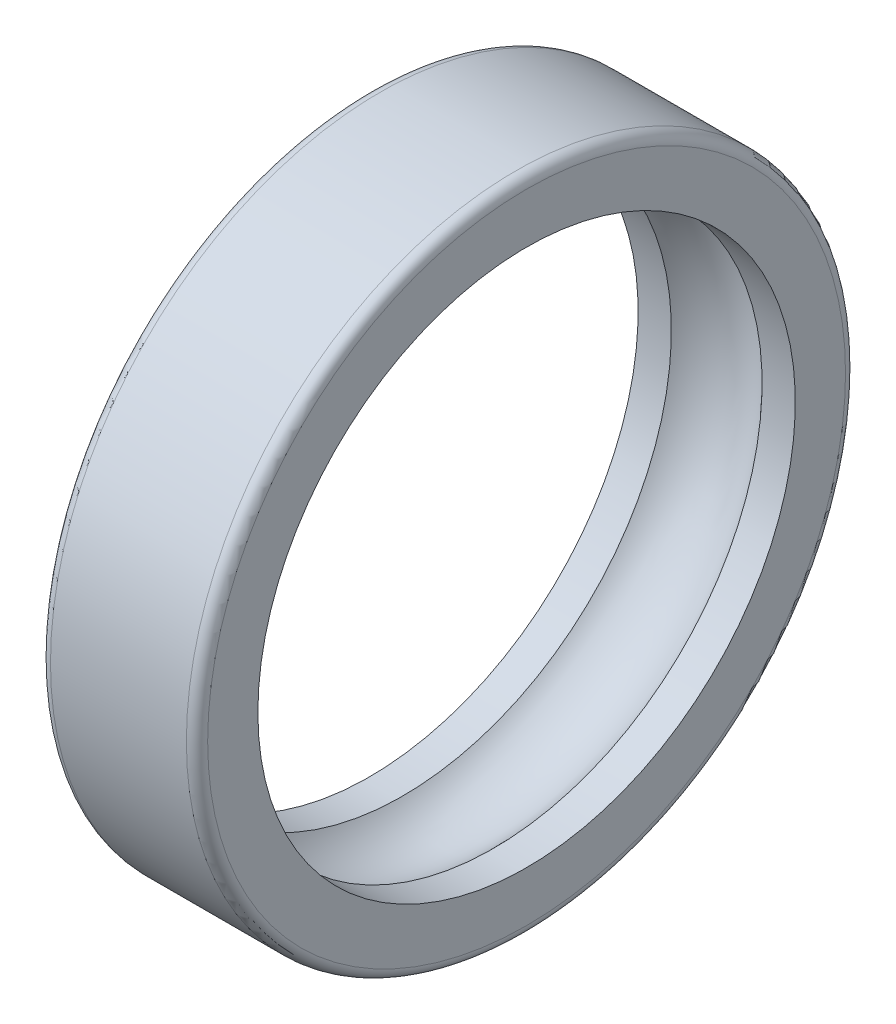
ISO-10303-21;
HEADER;
FILE_DESCRIPTION(('STEP AP214'),'2;1');
FILE_NAME('part.step','',(''),(''),'','','');
FILE_SCHEMA(('AUTOMOTIVE_DESIGN { 1 0 10303 214 1 1 1 1 }'));
ENDSEC;
DATA;
#1=APPLICATION_CONTEXT('core data for automotive mechanical design processes');
#2=APPLICATION_PROTOCOL_DEFINITION('international standard','automotive_design',2000,#1);
#3=PRODUCT_CONTEXT('',#1,'mechanical');
#4=PRODUCT('Part','Part','',(#3));
#5=PRODUCT_RELATED_PRODUCT_CATEGORY('part','',(#4));
#6=PRODUCT_DEFINITION_FORMATION('','',#4);
#7=PRODUCT_DEFINITION_CONTEXT('part definition',#1,'design');
#8=PRODUCT_DEFINITION('design','',#6,#7);
#9=PRODUCT_DEFINITION_SHAPE('','',#8);
#10=(LENGTH_UNIT() NAMED_UNIT(*) SI_UNIT(.MILLI.,.METRE.));
#11=(NAMED_UNIT(*) PLANE_ANGLE_UNIT() SI_UNIT($,.RADIAN.));
#12=(NAMED_UNIT(*) SI_UNIT($,.STERADIAN.) SOLID_ANGLE_UNIT());
#13=UNCERTAINTY_MEASURE_WITH_UNIT(LENGTH_MEASURE(1.E-05),#10,'distance_accuracy_value','');
#14=(GEOMETRIC_REPRESENTATION_CONTEXT(3) GLOBAL_UNCERTAINTY_ASSIGNED_CONTEXT((#13)) GLOBAL_UNIT_ASSIGNED_CONTEXT((#10,
#11,#12)) REPRESENTATION_CONTEXT('',''));
#15=CARTESIAN_POINT('',(0.,0.,0.));
#16=DIRECTION('',(0.,0.,1.));
#17=DIRECTION('',(1.,0.,0.));
#18=AXIS2_PLACEMENT_3D('',#15,#16,#17);
#19=CARTESIAN_POINT('',(-15.5,53.,0.));
#20=DIRECTION('',(1.,0.,0.));
#21=DIRECTION('',(0.,0.,-1.));
#22=AXIS2_PLACEMENT_3D('',#19,#20,#21);
#23=PLANE('',#22);
#24=CARTESIAN_POINT('',(-15.5,0.,0.));
#25=DIRECTION('',(1.,0.,0.));
#26=DIRECTION('',(0.,0.,-1.));
#27=AXIS2_PLACEMENT_3D('',#24,#25,#26);
#28=CIRCLE('',#27,62.9);
#29=CARTESIAN_POINT('',(-15.5,0.,-62.9));
#30=VERTEX_POINT('',#29);
#31=EDGE_CURVE('E10',#30,#30,#28,.F.);
#32=ORIENTED_EDGE('',*,*,#31,.T.);
#33=EDGE_LOOP('',(#32));
#34=FACE_BOUND('',#33,.T.);
#35=CARTESIAN_POINT('',(-15.5,0.,0.));
#36=DIRECTION('',(-1.,0.,0.));
#37=DIRECTION('',(0.,0.,1.));
#38=AXIS2_PLACEMENT_3D('',#35,#36,#37);
#39=CIRCLE('',#38,53.);
#40=CARTESIAN_POINT('',(-15.5,0.,53.));
#41=VERTEX_POINT('',#40);
#42=EDGE_CURVE('E68',#41,#41,#39,.T.);
#43=ORIENTED_EDGE('',*,*,#42,.F.);
#44=EDGE_LOOP('',(#43));
#45=FACE_BOUND('',#44,.T.);
#46=ADVANCED_FACE('F39',(#34,#45),#23,.F.);
#47=CARTESIAN_POINT('',(-18.2883597883598,0.,0.));
#48=DIRECTION('',(-1.,0.,0.));
#49=DIRECTION('',(0.,0.,1.));
#50=AXIS2_PLACEMENT_3D('',#47,#48,#49);
#51=CYLINDRICAL_SURFACE('',#50,65.);
#52=CARTESIAN_POINT('',(13.4,0.,0.));
#53=DIRECTION('',(-1.,0.,0.));
#54=DIRECTION('',(0.,0.,1.));
#55=AXIS2_PLACEMENT_3D('',#52,#53,#54);
#56=CIRCLE('',#55,65.);
#57=CARTESIAN_POINT('',(13.4,0.,65.));
#58=VERTEX_POINT('',#57);
#59=EDGE_CURVE('E50',#58,#58,#56,.T.);
#60=ORIENTED_EDGE('',*,*,#59,.T.);
#61=EDGE_LOOP('',(#60));
#62=FACE_BOUND('',#61,.T.);
#63=CARTESIAN_POINT('',(-13.4,0.,0.));
#64=DIRECTION('',(1.,0.,0.));
#65=DIRECTION('',(0.,0.,-1.));
#66=AXIS2_PLACEMENT_3D('',#63,#64,#65);
#67=CIRCLE('',#66,65.);
#68=CARTESIAN_POINT('',(-13.4,0.,-65.));
#69=VERTEX_POINT('',#68);
#70=EDGE_CURVE('E54',#69,#69,#67,.T.);
#71=ORIENTED_EDGE('',*,*,#70,.T.);
#72=EDGE_LOOP('',(#71));
#73=FACE_BOUND('',#72,.T.);
#74=ADVANCED_FACE('F75',(#62,#73),#51,.T.);
#75=CARTESIAN_POINT('',(15.5,53.,0.));
#76=DIRECTION('',(-1.,0.,0.));
#77=DIRECTION('',(0.,0.,1.));
#78=AXIS2_PLACEMENT_3D('',#75,#76,#77);
#79=PLANE('',#78);
#80=CARTESIAN_POINT('',(15.5,0.,0.));
#81=DIRECTION('',(-1.,0.,0.));
#82=DIRECTION('',(0.,0.,1.));
#83=AXIS2_PLACEMENT_3D('',#80,#81,#82);
#84=CIRCLE('',#83,62.9);
#85=CARTESIAN_POINT('',(15.5,0.,62.9));
#86=VERTEX_POINT('',#85);
#87=EDGE_CURVE('E46',#86,#86,#84,.F.);
#88=ORIENTED_EDGE('',*,*,#87,.T.);
#89=EDGE_LOOP('',(#88));
#90=FACE_BOUND('',#89,.T.);
#91=CARTESIAN_POINT('',(15.5,0.,0.));
#92=DIRECTION('',(-1.,0.,0.));
#93=DIRECTION('',(0.,0.,1.));
#94=AXIS2_PLACEMENT_3D('',#91,#92,#93);
#95=CIRCLE('',#94,53.);
#96=CARTESIAN_POINT('',(15.5,0.,53.));
#97=VERTEX_POINT('',#96);
#98=EDGE_CURVE('E59',#97,#97,#95,.T.);
#99=ORIENTED_EDGE('',*,*,#98,.T.);
#100=EDGE_LOOP('',(#99));
#101=FACE_BOUND('',#100,.T.);
#102=ADVANCED_FACE('F80',(#90,#101),#79,.F.);
#103=CARTESIAN_POINT('',(-18.2883597883598,0.,0.));
#104=DIRECTION('',(-1.,0.,0.));
#105=DIRECTION('',(0.,0.,1.));
#106=AXIS2_PLACEMENT_3D('',#103,#104,#105);
#107=CYLINDRICAL_SURFACE('',#106,53.);
#108=ORIENTED_EDGE('',*,*,#98,.F.);
#109=EDGE_LOOP('',(#108));
#110=FACE_BOUND('',#109,.T.);
#111=CARTESIAN_POINT('',(8.94427190999915,0.,0.));
#112=DIRECTION('',(-1.,0.,0.));
#113=DIRECTION('',(0.,0.,1.));
#114=AXIS2_PLACEMENT_3D('',#111,#112,#113);
#115=CIRCLE('',#114,53.);
#116=CARTESIAN_POINT('',(8.94427190999915,0.,53.));
#117=VERTEX_POINT('',#116);
#118=EDGE_CURVE('E62',#117,#117,#115,.T.);
#119=ORIENTED_EDGE('',*,*,#118,.T.);
#120=EDGE_LOOP('',(#119));
#121=FACE_BOUND('',#120,.T.);
#122=ADVANCED_FACE('F103',(#110,#121),#107,.F.);
#123=CARTESIAN_POINT('',(0.,0.,0.));
#124=DIRECTION('',(-1.,0.,0.));
#125=DIRECTION('',(0.,0.,1.));
#126=AXIS2_PLACEMENT_3D('',#123,#124,#125);
#127=TOROIDAL_SURFACE('',#126,45.,12.);
#128=ORIENTED_EDGE('',*,*,#118,.F.);
#129=EDGE_LOOP('',(#128));
#130=FACE_BOUND('',#129,.T.);
#131=CARTESIAN_POINT('',(-8.94427190999915,0.,0.));
#132=DIRECTION('',(-1.,0.,0.));
#133=DIRECTION('',(0.,0.,1.));
#134=AXIS2_PLACEMENT_3D('',#131,#132,#133);
#135=CIRCLE('',#134,53.);
#136=CARTESIAN_POINT('',(-8.94427190999915,0.,53.));
#137=VERTEX_POINT('',#136);
#138=EDGE_CURVE('E65',#137,#137,#135,.T.);
#139=ORIENTED_EDGE('',*,*,#138,.T.);
#140=EDGE_LOOP('',(#139));
#141=FACE_BOUND('',#140,.T.);
#142=ADVANCED_FACE('F92',(#130,#141),#127,.F.);
#143=CARTESIAN_POINT('',(-18.2883597883598,0.,0.));
#144=DIRECTION('',(-1.,0.,0.));
#145=DIRECTION('',(0.,0.,1.));
#146=AXIS2_PLACEMENT_3D('',#143,#144,#145);
#147=CYLINDRICAL_SURFACE('',#146,53.);
#148=ORIENTED_EDGE('',*,*,#138,.F.);
#149=EDGE_LOOP('',(#148));
#150=FACE_BOUND('',#149,.T.);
#151=ORIENTED_EDGE('',*,*,#42,.T.);
#152=EDGE_LOOP('',(#151));
#153=FACE_BOUND('',#152,.T.);
#154=ADVANCED_FACE('F72',(#150,#153),#147,.F.);
#155=CARTESIAN_POINT('',(13.4,0.,0.));
#156=DIRECTION('',(-1.,0.,0.));
#157=DIRECTION('',(0.,0.,1.));
#158=AXIS2_PLACEMENT_3D('',#155,#156,#157);
#159=TOROIDAL_SURFACE('',#158,62.9,2.1);
#160=ORIENTED_EDGE('',*,*,#87,.F.);
#161=EDGE_LOOP('',(#160));
#162=FACE_BOUND('',#161,.T.);
#163=ORIENTED_EDGE('',*,*,#59,.F.);
#164=EDGE_LOOP('',(#163));
#165=FACE_BOUND('',#164,.T.);
#166=ADVANCED_FACE('F84',(#162,#165),#159,.T.);
#167=CARTESIAN_POINT('',(-13.4,0.,0.));
#168=DIRECTION('',(1.,0.,0.));
#169=DIRECTION('',(0.,0.,-1.));
#170=AXIS2_PLACEMENT_3D('',#167,#168,#169);
#171=TOROIDAL_SURFACE('',#170,62.9,2.1);
#172=ORIENTED_EDGE('',*,*,#70,.F.);
#173=EDGE_LOOP('',(#172));
#174=FACE_BOUND('',#173,.T.);
#175=ORIENTED_EDGE('',*,*,#31,.F.);
#176=EDGE_LOOP('',(#175));
#177=FACE_BOUND('',#176,.T.);
#178=ADVANCED_FACE('F41',(#174,#177),#171,.T.);
#179=CLOSED_SHELL('',(#46,#74,#102,#122,#142,#154,#166,#178));
#180=MANIFOLD_SOLID_BREP('B2',#179);
#181=ADVANCED_BREP_SHAPE_REPRESENTATION('',(#18,#180),#14);
#182=SHAPE_DEFINITION_REPRESENTATION(#9,#181);
ENDSEC;
END-ISO-10303-21;
